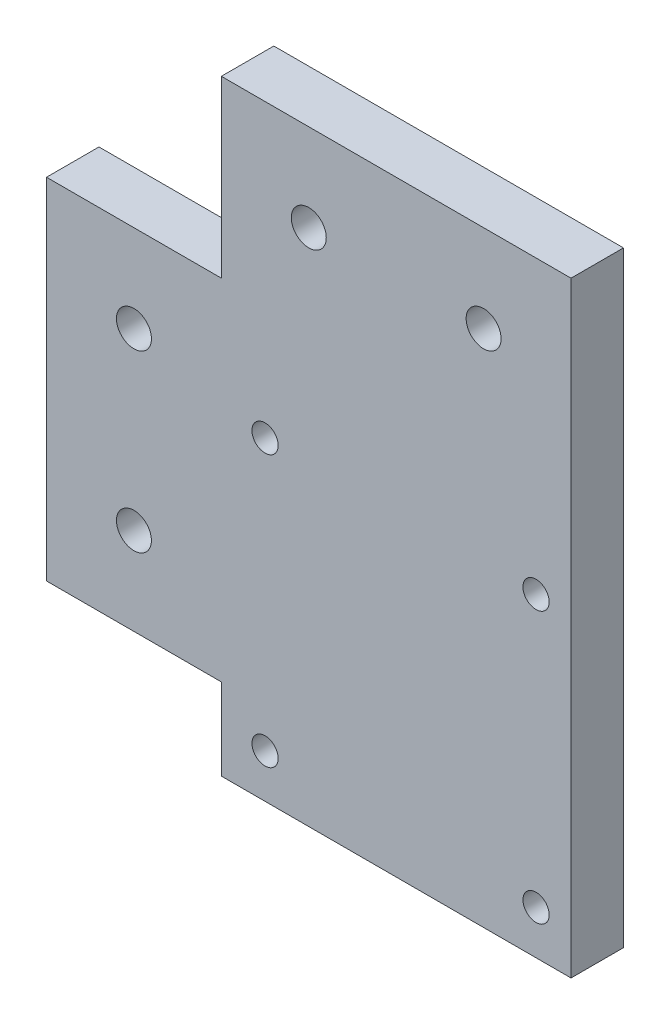
ISO-10303-21;
HEADER;
FILE_DESCRIPTION(('STEP AP214'),'2;1');
FILE_NAME('part.step','',(''),(''),'','','');
FILE_SCHEMA(('AUTOMOTIVE_DESIGN { 1 0 10303 214 1 1 1 1 }'));
ENDSEC;
DATA;
#1=APPLICATION_CONTEXT('core data for automotive mechanical design processes');
#2=APPLICATION_PROTOCOL_DEFINITION('international standard','automotive_design',2000,#1);
#3=PRODUCT_CONTEXT('',#1,'mechanical');
#4=PRODUCT('Part','Part','',(#3));
#5=PRODUCT_RELATED_PRODUCT_CATEGORY('part','',(#4));
#6=PRODUCT_DEFINITION_FORMATION('','',#4);
#7=PRODUCT_DEFINITION_CONTEXT('part definition',#1,'design');
#8=PRODUCT_DEFINITION('design','',#6,#7);
#9=PRODUCT_DEFINITION_SHAPE('','',#8);
#10=(LENGTH_UNIT() NAMED_UNIT(*) SI_UNIT(.MILLI.,.METRE.));
#11=(NAMED_UNIT(*) PLANE_ANGLE_UNIT() SI_UNIT($,.RADIAN.));
#12=(NAMED_UNIT(*) SI_UNIT($,.STERADIAN.) SOLID_ANGLE_UNIT());
#13=UNCERTAINTY_MEASURE_WITH_UNIT(LENGTH_MEASURE(1.E-05),#10,'distance_accuracy_value','');
#14=(GEOMETRIC_REPRESENTATION_CONTEXT(3) GLOBAL_UNCERTAINTY_ASSIGNED_CONTEXT((#13)) GLOBAL_UNIT_ASSIGNED_CONTEXT((#10,
#11,#12)) REPRESENTATION_CONTEXT('',''));
#15=CARTESIAN_POINT('',(0.,0.,0.));
#16=DIRECTION('',(0.,0.,1.));
#17=DIRECTION('',(1.,0.,0.));
#18=AXIS2_PLACEMENT_3D('',#15,#16,#17);
#19=CARTESIAN_POINT('',(0.,0.,6.));
#20=DIRECTION('',(0.,0.,1.));
#21=DIRECTION('',(1.,0.,0.));
#22=AXIS2_PLACEMENT_3D('',#19,#20,#21);
#23=PLANE('',#22);
#24=CARTESIAN_POINT('',(56.,-64.3319231231537,6.));
#25=DIRECTION('',(0.,0.,1.));
#26=DIRECTION('',(1.,0.,0.));
#27=AXIS2_PLACEMENT_3D('',#24,#25,#26);
#28=CIRCLE('',#27,1.5);
#29=CARTESIAN_POINT('',(57.5,-64.3319231231537,6.));
#30=VERTEX_POINT('',#29);
#31=EDGE_CURVE('E216',#30,#30,#28,.T.);
#32=ORIENTED_EDGE('',*,*,#31,.F.);
#33=EDGE_LOOP('',(#32));
#34=FACE_BOUND('',#33,.T.);
#35=CARTESIAN_POINT('',(25.,-64.3319231231537,6.));
#36=DIRECTION('',(0.,0.,1.));
#37=DIRECTION('',(1.,0.,0.));
#38=AXIS2_PLACEMENT_3D('',#35,#36,#37);
#39=CIRCLE('',#38,1.5);
#40=CARTESIAN_POINT('',(26.5,-64.3319231231537,6.));
#41=VERTEX_POINT('',#40);
#42=EDGE_CURVE('E204',#41,#41,#39,.T.);
#43=ORIENTED_EDGE('',*,*,#42,.F.);
#44=EDGE_LOOP('',(#43));
#45=FACE_BOUND('',#44,.T.);
#46=CARTESIAN_POINT('',(10.,-50.,6.));
#47=DIRECTION('',(0.,0.,1.));
#48=DIRECTION('',(1.,0.,0.));
#49=AXIS2_PLACEMENT_3D('',#46,#47,#48);
#50=CIRCLE('',#49,2.);
#51=CARTESIAN_POINT('',(12.,-50.,6.));
#52=VERTEX_POINT('',#51);
#53=EDGE_CURVE('E192',#52,#52,#50,.T.);
#54=ORIENTED_EDGE('',*,*,#53,.F.);
#55=EDGE_LOOP('',(#54));
#56=FACE_BOUND('',#55,.T.);
#57=CARTESIAN_POINT('',(50.,-10.,6.));
#58=DIRECTION('',(0.,0.,1.));
#59=DIRECTION('',(1.,0.,0.));
#60=AXIS2_PLACEMENT_3D('',#57,#58,#59);
#61=CIRCLE('',#60,2.);
#62=CARTESIAN_POINT('',(52.,-10.,6.));
#63=VERTEX_POINT('',#62);
#64=EDGE_CURVE('E138',#63,#63,#61,.T.);
#65=ORIENTED_EDGE('',*,*,#64,.F.);
#66=EDGE_LOOP('',(#65));
#67=FACE_BOUND('',#66,.T.);
#68=DIRECTION('',(1.,0.,0.));
#69=VECTOR('',#68,1.);
#70=CARTESIAN_POINT('',(0.,-60.,6.));
#71=LINE('',#70,#69);
#72=CARTESIAN_POINT('',(0.,-60.,6.));
#73=VERTEX_POINT('',#72);
#74=CARTESIAN_POINT('',(20.,-60.,6.));
#75=VERTEX_POINT('',#74);
#76=EDGE_CURVE('E150',#73,#75,#71,.T.);
#77=ORIENTED_EDGE('',*,*,#76,.T.);
#78=DIRECTION('',(0.,-1.,0.));
#79=VECTOR('',#78,1.);
#80=CARTESIAN_POINT('',(20.,-69.3319231231537,6.));
#81=LINE('',#80,#79);
#82=CARTESIAN_POINT('',(20.,-69.3319231231537,6.));
#83=VERTEX_POINT('',#82);
#84=EDGE_CURVE('E97',#75,#83,#81,.T.);
#85=ORIENTED_EDGE('',*,*,#84,.T.);
#86=DIRECTION('',(1.,0.,0.));
#87=VECTOR('',#86,1.);
#88=CARTESIAN_POINT('',(20.,-69.3319231231537,6.));
#89=LINE('',#88,#87);
#90=CARTESIAN_POINT('',(60.,-69.3319231231537,6.));
#91=VERTEX_POINT('',#90);
#92=EDGE_CURVE('E165',#83,#91,#89,.T.);
#93=ORIENTED_EDGE('',*,*,#92,.T.);
#94=DIRECTION('',(0.,1.,0.));
#95=VECTOR('',#94,1.);
#96=CARTESIAN_POINT('',(60.,-20.,6.));
#97=LINE('',#96,#95);
#98=CARTESIAN_POINT('',(60.,0.,6.));
#99=VERTEX_POINT('',#98);
#100=EDGE_CURVE('E177',#91,#99,#97,.T.);
#101=ORIENTED_EDGE('',*,*,#100,.T.);
#102=DIRECTION('',(-1.,0.,0.));
#103=VECTOR('',#102,1.);
#104=CARTESIAN_POINT('',(20.0000000001893,0.,6.));
#105=LINE('',#104,#103);
#106=CARTESIAN_POINT('',(20.0000000001893,0.,6.));
#107=VERTEX_POINT('',#106);
#108=EDGE_CURVE('E116',#99,#107,#105,.T.);
#109=ORIENTED_EDGE('',*,*,#108,.T.);
#110=DIRECTION('',(0.,-1.,0.));
#111=VECTOR('',#110,1.);
#112=CARTESIAN_POINT('',(20.0000000001893,0.,6.));
#113=LINE('',#112,#111);
#114=CARTESIAN_POINT('',(20.0000000001893,-20.0000000001893,6.));
#115=VERTEX_POINT('',#114);
#116=EDGE_CURVE('E110',#107,#115,#113,.T.);
#117=ORIENTED_EDGE('',*,*,#116,.T.);
#118=DIRECTION('',(-1.,0.,0.));
#119=VECTOR('',#118,1.);
#120=CARTESIAN_POINT('',(0.,-20.0000000001893,6.));
#121=LINE('',#120,#119);
#122=CARTESIAN_POINT('',(0.,-20.0000000001893,6.));
#123=VERTEX_POINT('',#122);
#124=EDGE_CURVE('E114',#115,#123,#121,.T.);
#125=ORIENTED_EDGE('',*,*,#124,.T.);
#126=DIRECTION('',(0.,-1.,0.));
#127=VECTOR('',#126,1.);
#128=CARTESIAN_POINT('',(0.,-20.0000000001893,6.));
#129=LINE('',#128,#127);
#130=EDGE_CURVE('E54',#123,#73,#129,.T.);
#131=ORIENTED_EDGE('',*,*,#130,.T.);
#132=EDGE_LOOP('',(#77,#85,#93,#101,#109,#117,#125,#131));
#133=FACE_BOUND('',#132,.T.);
#134=CARTESIAN_POINT('',(30.,-10.,6.));
#135=DIRECTION('',(0.,0.,1.));
#136=DIRECTION('',(1.,0.,0.));
#137=AXIS2_PLACEMENT_3D('',#134,#135,#136);
#138=CIRCLE('',#137,2.);
#139=CARTESIAN_POINT('',(32.,-10.,6.));
#140=VERTEX_POINT('',#139);
#141=EDGE_CURVE('E186',#140,#140,#138,.T.);
#142=ORIENTED_EDGE('',*,*,#141,.F.);
#143=EDGE_LOOP('',(#142));
#144=FACE_BOUND('',#143,.T.);
#145=CARTESIAN_POINT('',(10.,-30.,6.));
#146=DIRECTION('',(0.,0.,1.));
#147=DIRECTION('',(1.,0.,0.));
#148=AXIS2_PLACEMENT_3D('',#145,#146,#147);
#149=CIRCLE('',#148,2.);
#150=CARTESIAN_POINT('',(12.,-30.,6.));
#151=VERTEX_POINT('',#150);
#152=EDGE_CURVE('E198',#151,#151,#149,.T.);
#153=ORIENTED_EDGE('',*,*,#152,.F.);
#154=EDGE_LOOP('',(#153));
#155=FACE_BOUND('',#154,.T.);
#156=CARTESIAN_POINT('',(24.9973486711841,-33.3319232365334,6.));
#157=DIRECTION('',(0.,0.,1.));
#158=DIRECTION('',(1.,0.,0.));
#159=AXIS2_PLACEMENT_3D('',#156,#157,#158);
#160=CIRCLE('',#159,1.5);
#161=CARTESIAN_POINT('',(26.4973486711841,-33.3319232365334,6.));
#162=VERTEX_POINT('',#161);
#163=EDGE_CURVE('E210',#162,#162,#160,.T.);
#164=ORIENTED_EDGE('',*,*,#163,.F.);
#165=EDGE_LOOP('',(#164));
#166=FACE_BOUND('',#165,.T.);
#167=CARTESIAN_POINT('',(55.9973486711841,-33.3319231231537,6.));
#168=DIRECTION('',(0.,0.,1.));
#169=DIRECTION('',(1.,0.,0.));
#170=AXIS2_PLACEMENT_3D('',#167,#168,#169);
#171=CIRCLE('',#170,1.5);
#172=CARTESIAN_POINT('',(57.4973486711841,-33.3319231231537,6.));
#173=VERTEX_POINT('',#172);
#174=EDGE_CURVE('E222',#173,#173,#171,.T.);
#175=ORIENTED_EDGE('',*,*,#174,.F.);
#176=EDGE_LOOP('',(#175));
#177=FACE_BOUND('',#176,.T.);
#178=ADVANCED_FACE('F37',(#34,#45,#56,#67,#133,#144,#155,#166,#177),#23,.T.);
#179=CARTESIAN_POINT('',(0.,0.,0.));
#180=DIRECTION('',(0.,0.,1.));
#181=DIRECTION('',(1.,0.,0.));
#182=AXIS2_PLACEMENT_3D('',#179,#180,#181);
#183=PLANE('',#182);
#184=DIRECTION('',(1.,0.,0.));
#185=VECTOR('',#184,1.);
#186=CARTESIAN_POINT('',(0.,-60.,0.));
#187=LINE('',#186,#185);
#188=CARTESIAN_POINT('',(0.,-60.,0.));
#189=VERTEX_POINT('',#188);
#190=CARTESIAN_POINT('',(20.,-60.,0.));
#191=VERTEX_POINT('',#190);
#192=EDGE_CURVE('E134',#189,#191,#187,.T.);
#193=ORIENTED_EDGE('',*,*,#192,.F.);
#194=DIRECTION('',(0.,-1.,0.));
#195=VECTOR('',#194,1.);
#196=CARTESIAN_POINT('',(0.,-20.0000000001893,0.));
#197=LINE('',#196,#195);
#198=CARTESIAN_POINT('',(0.,-20.0000000001893,0.));
#199=VERTEX_POINT('',#198);
#200=EDGE_CURVE('E89',#199,#189,#197,.T.);
#201=ORIENTED_EDGE('',*,*,#200,.F.);
#202=DIRECTION('',(-1.,0.,0.));
#203=VECTOR('',#202,1.);
#204=CARTESIAN_POINT('',(0.,-20.0000000001893,0.));
#205=LINE('',#204,#203);
#206=CARTESIAN_POINT('',(20.0000000001893,-20.0000000001893,0.));
#207=VERTEX_POINT('',#206);
#208=EDGE_CURVE('E83',#207,#199,#205,.T.);
#209=ORIENTED_EDGE('',*,*,#208,.F.);
#210=DIRECTION('',(0.,-1.,0.));
#211=VECTOR('',#210,1.);
#212=CARTESIAN_POINT('',(20.0000000001893,0.,0.));
#213=LINE('',#212,#211);
#214=CARTESIAN_POINT('',(20.0000000001893,0.,0.));
#215=VERTEX_POINT('',#214);
#216=EDGE_CURVE('E124',#215,#207,#213,.T.);
#217=ORIENTED_EDGE('',*,*,#216,.F.);
#218=DIRECTION('',(-1.,0.,0.));
#219=VECTOR('',#218,1.);
#220=CARTESIAN_POINT('',(20.0000000001893,0.,0.));
#221=LINE('',#220,#219);
#222=CARTESIAN_POINT('',(60.,0.,0.));
#223=VERTEX_POINT('',#222);
#224=EDGE_CURVE('E145',#223,#215,#221,.T.);
#225=ORIENTED_EDGE('',*,*,#224,.F.);
#226=DIRECTION('',(0.,1.,0.));
#227=VECTOR('',#226,1.);
#228=CARTESIAN_POINT('',(60.,0.,0.));
#229=LINE('',#228,#227);
#230=CARTESIAN_POINT('',(60.,-69.3319231231537,0.));
#231=VERTEX_POINT('',#230);
#232=EDGE_CURVE('E143',#231,#223,#229,.T.);
#233=ORIENTED_EDGE('',*,*,#232,.F.);
#234=DIRECTION('',(1.,0.,0.));
#235=VECTOR('',#234,1.);
#236=CARTESIAN_POINT('',(20.,-69.3319231231537,0.));
#237=LINE('',#236,#235);
#238=CARTESIAN_POINT('',(20.,-69.3319231231537,0.));
#239=VERTEX_POINT('',#238);
#240=EDGE_CURVE('E140',#239,#231,#237,.T.);
#241=ORIENTED_EDGE('',*,*,#240,.F.);
#242=DIRECTION('',(0.,-1.,0.));
#243=VECTOR('',#242,1.);
#244=CARTESIAN_POINT('',(20.,-69.3319231231537,0.));
#245=LINE('',#244,#243);
#246=EDGE_CURVE('E137',#191,#239,#245,.T.);
#247=ORIENTED_EDGE('',*,*,#246,.F.);
#248=EDGE_LOOP('',(#193,#201,#209,#217,#225,#233,#241,#247));
#249=FACE_BOUND('',#248,.T.);
#250=CARTESIAN_POINT('',(50.,-10.,0.));
#251=DIRECTION('',(0.,0.,1.));
#252=DIRECTION('',(1.,0.,0.));
#253=AXIS2_PLACEMENT_3D('',#250,#251,#252);
#254=CIRCLE('',#253,2.);
#255=CARTESIAN_POINT('',(52.,-10.,0.));
#256=VERTEX_POINT('',#255);
#257=EDGE_CURVE('E183',#256,#256,#254,.T.);
#258=ORIENTED_EDGE('',*,*,#257,.T.);
#259=EDGE_LOOP('',(#258));
#260=FACE_BOUND('',#259,.T.);
#261=CARTESIAN_POINT('',(30.,-10.,0.));
#262=DIRECTION('',(0.,0.,1.));
#263=DIRECTION('',(1.,0.,0.));
#264=AXIS2_PLACEMENT_3D('',#261,#262,#263);
#265=CIRCLE('',#264,2.);
#266=CARTESIAN_POINT('',(32.,-10.,0.));
#267=VERTEX_POINT('',#266);
#268=EDGE_CURVE('E189',#267,#267,#265,.T.);
#269=ORIENTED_EDGE('',*,*,#268,.T.);
#270=EDGE_LOOP('',(#269));
#271=FACE_BOUND('',#270,.T.);
#272=CARTESIAN_POINT('',(10.,-50.,0.));
#273=DIRECTION('',(0.,0.,1.));
#274=DIRECTION('',(1.,0.,0.));
#275=AXIS2_PLACEMENT_3D('',#272,#273,#274);
#276=CIRCLE('',#275,2.);
#277=CARTESIAN_POINT('',(12.,-50.,0.));
#278=VERTEX_POINT('',#277);
#279=EDGE_CURVE('E195',#278,#278,#276,.T.);
#280=ORIENTED_EDGE('',*,*,#279,.T.);
#281=EDGE_LOOP('',(#280));
#282=FACE_BOUND('',#281,.T.);
#283=CARTESIAN_POINT('',(10.,-30.,0.));
#284=DIRECTION('',(0.,0.,1.));
#285=DIRECTION('',(1.,0.,0.));
#286=AXIS2_PLACEMENT_3D('',#283,#284,#285);
#287=CIRCLE('',#286,2.);
#288=CARTESIAN_POINT('',(12.,-30.,0.));
#289=VERTEX_POINT('',#288);
#290=EDGE_CURVE('E201',#289,#289,#287,.T.);
#291=ORIENTED_EDGE('',*,*,#290,.T.);
#292=EDGE_LOOP('',(#291));
#293=FACE_BOUND('',#292,.T.);
#294=CARTESIAN_POINT('',(25.,-64.3319231231537,0.));
#295=DIRECTION('',(0.,0.,1.));
#296=DIRECTION('',(1.,0.,0.));
#297=AXIS2_PLACEMENT_3D('',#294,#295,#296);
#298=CIRCLE('',#297,1.5);
#299=CARTESIAN_POINT('',(26.5,-64.3319231231537,0.));
#300=VERTEX_POINT('',#299);
#301=EDGE_CURVE('E207',#300,#300,#298,.T.);
#302=ORIENTED_EDGE('',*,*,#301,.T.);
#303=EDGE_LOOP('',(#302));
#304=FACE_BOUND('',#303,.T.);
#305=CARTESIAN_POINT('',(24.9973486711841,-33.3319232365334,0.));
#306=DIRECTION('',(0.,0.,1.));
#307=DIRECTION('',(1.,0.,0.));
#308=AXIS2_PLACEMENT_3D('',#305,#306,#307);
#309=CIRCLE('',#308,1.5);
#310=CARTESIAN_POINT('',(26.4973486711841,-33.3319232365334,0.));
#311=VERTEX_POINT('',#310);
#312=EDGE_CURVE('E213',#311,#311,#309,.T.);
#313=ORIENTED_EDGE('',*,*,#312,.T.);
#314=EDGE_LOOP('',(#313));
#315=FACE_BOUND('',#314,.T.);
#316=CARTESIAN_POINT('',(56.,-64.3319231231537,0.));
#317=DIRECTION('',(0.,0.,1.));
#318=DIRECTION('',(1.,0.,0.));
#319=AXIS2_PLACEMENT_3D('',#316,#317,#318);
#320=CIRCLE('',#319,1.5);
#321=CARTESIAN_POINT('',(57.5,-64.3319231231537,0.));
#322=VERTEX_POINT('',#321);
#323=EDGE_CURVE('E219',#322,#322,#320,.T.);
#324=ORIENTED_EDGE('',*,*,#323,.T.);
#325=EDGE_LOOP('',(#324));
#326=FACE_BOUND('',#325,.T.);
#327=CARTESIAN_POINT('',(55.9973486711841,-33.3319231231537,0.));
#328=DIRECTION('',(0.,0.,1.));
#329=DIRECTION('',(1.,0.,0.));
#330=AXIS2_PLACEMENT_3D('',#327,#328,#329);
#331=CIRCLE('',#330,1.5);
#332=CARTESIAN_POINT('',(57.4973486711841,-33.3319231231537,0.));
#333=VERTEX_POINT('',#332);
#334=EDGE_CURVE('E225',#333,#333,#331,.T.);
#335=ORIENTED_EDGE('',*,*,#334,.T.);
#336=EDGE_LOOP('',(#335));
#337=FACE_BOUND('',#336,.T.);
#338=ADVANCED_FACE('F168',(#249,#260,#271,#282,#293,#304,#315,#326,#337),#183,.F.);
#339=CARTESIAN_POINT('',(0.,-60.,6.));
#340=DIRECTION('',(0.,1.,0.));
#341=DIRECTION('',(0.,0.,1.));
#342=AXIS2_PLACEMENT_3D('',#339,#340,#341);
#343=PLANE('',#342);
#344=ORIENTED_EDGE('',*,*,#192,.T.);
#345=DIRECTION('',(0.,0.,-1.));
#346=VECTOR('',#345,1.);
#347=CARTESIAN_POINT('',(20.,-60.,6.));
#348=LINE('',#347,#346);
#349=EDGE_CURVE('E11',#75,#191,#348,.T.);
#350=ORIENTED_EDGE('',*,*,#349,.F.);
#351=ORIENTED_EDGE('',*,*,#76,.F.);
#352=DIRECTION('',(0.,0.,-1.));
#353=VECTOR('',#352,1.);
#354=CARTESIAN_POINT('',(0.,-60.,6.));
#355=LINE('',#354,#353);
#356=EDGE_CURVE('E130',#73,#189,#355,.T.);
#357=ORIENTED_EDGE('',*,*,#356,.T.);
#358=EDGE_LOOP('',(#344,#350,#351,#357));
#359=FACE_BOUND('',#358,.T.);
#360=ADVANCED_FACE('F39',(#359),#343,.F.);
#361=CARTESIAN_POINT('',(20.,-69.3319231231537,6.));
#362=DIRECTION('',(1.,0.,0.));
#363=DIRECTION('',(0.,1.,0.));
#364=AXIS2_PLACEMENT_3D('',#361,#362,#363);
#365=PLANE('',#364);
#366=ORIENTED_EDGE('',*,*,#246,.T.);
#367=DIRECTION('',(0.,0.,-1.));
#368=VECTOR('',#367,1.);
#369=CARTESIAN_POINT('',(20.,-69.3319231231537,6.));
#370=LINE('',#369,#368);
#371=EDGE_CURVE('E46',#83,#239,#370,.T.);
#372=ORIENTED_EDGE('',*,*,#371,.F.);
#373=ORIENTED_EDGE('',*,*,#84,.F.);
#374=ORIENTED_EDGE('',*,*,#349,.T.);
#375=EDGE_LOOP('',(#366,#372,#373,#374));
#376=FACE_BOUND('',#375,.T.);
#377=ADVANCED_FACE('F259',(#376),#365,.F.);
#378=CARTESIAN_POINT('',(20.,-69.3319231231537,6.));
#379=DIRECTION('',(0.,1.,0.));
#380=DIRECTION('',(0.,0.,1.));
#381=AXIS2_PLACEMENT_3D('',#378,#379,#380);
#382=PLANE('',#381);
#383=ORIENTED_EDGE('',*,*,#240,.T.);
#384=DIRECTION('',(0.,0.,-1.));
#385=VECTOR('',#384,1.);
#386=CARTESIAN_POINT('',(60.,-69.3319231231537,6.));
#387=LINE('',#386,#385);
#388=EDGE_CURVE('E157',#91,#231,#387,.T.);
#389=ORIENTED_EDGE('',*,*,#388,.F.);
#390=ORIENTED_EDGE('',*,*,#92,.F.);
#391=ORIENTED_EDGE('',*,*,#371,.T.);
#392=EDGE_LOOP('',(#383,#389,#390,#391));
#393=FACE_BOUND('',#392,.T.);
#394=ADVANCED_FACE('F163',(#393),#382,.F.);
#395=CARTESIAN_POINT('',(60.,0.,6.));
#396=DIRECTION('',(-1.,0.,0.));
#397=DIRECTION('',(0.,0.,1.));
#398=AXIS2_PLACEMENT_3D('',#395,#396,#397);
#399=PLANE('',#398);
#400=ORIENTED_EDGE('',*,*,#232,.T.);
#401=DIRECTION('',(0.,0.,-1.));
#402=VECTOR('',#401,1.);
#403=CARTESIAN_POINT('',(60.,0.,6.));
#404=LINE('',#403,#402);
#405=EDGE_CURVE('E154',#99,#223,#404,.T.);
#406=ORIENTED_EDGE('',*,*,#405,.F.);
#407=ORIENTED_EDGE('',*,*,#100,.F.);
#408=ORIENTED_EDGE('',*,*,#388,.T.);
#409=EDGE_LOOP('',(#400,#406,#407,#408));
#410=FACE_BOUND('',#409,.T.);
#411=ADVANCED_FACE('F173',(#410),#399,.F.);
#412=CARTESIAN_POINT('',(20.0000000001893,0.,6.));
#413=DIRECTION('',(0.,-1.,0.));
#414=DIRECTION('',(0.,0.,-1.));
#415=AXIS2_PLACEMENT_3D('',#412,#413,#414);
#416=PLANE('',#415);
#417=ORIENTED_EDGE('',*,*,#224,.T.);
#418=DIRECTION('',(0.,0.,-1.));
#419=VECTOR('',#418,1.);
#420=CARTESIAN_POINT('',(20.0000000001893,0.,6.));
#421=LINE('',#420,#419);
#422=EDGE_CURVE('E125',#107,#215,#421,.T.);
#423=ORIENTED_EDGE('',*,*,#422,.F.);
#424=ORIENTED_EDGE('',*,*,#108,.F.);
#425=ORIENTED_EDGE('',*,*,#405,.T.);
#426=EDGE_LOOP('',(#417,#423,#424,#425));
#427=FACE_BOUND('',#426,.T.);
#428=ADVANCED_FACE('F176',(#427),#416,.F.);
#429=CARTESIAN_POINT('',(20.0000000001893,0.,6.));
#430=DIRECTION('',(1.,0.,0.));
#431=DIRECTION('',(0.,1.,0.));
#432=AXIS2_PLACEMENT_3D('',#429,#430,#431);
#433=PLANE('',#432);
#434=ORIENTED_EDGE('',*,*,#216,.T.);
#435=DIRECTION('',(0.,0.,-1.));
#436=VECTOR('',#435,1.);
#437=CARTESIAN_POINT('',(20.0000000001893,-20.0000000001893,6.));
#438=LINE('',#437,#436);
#439=EDGE_CURVE('E121',#115,#207,#438,.T.);
#440=ORIENTED_EDGE('',*,*,#439,.F.);
#441=ORIENTED_EDGE('',*,*,#116,.F.);
#442=ORIENTED_EDGE('',*,*,#422,.T.);
#443=EDGE_LOOP('',(#434,#440,#441,#442));
#444=FACE_BOUND('',#443,.T.);
#445=ADVANCED_FACE('F122',(#444),#433,.F.);
#446=CARTESIAN_POINT('',(0.,-20.0000000001893,6.));
#447=DIRECTION('',(0.,-1.,0.));
#448=DIRECTION('',(0.,0.,-1.));
#449=AXIS2_PLACEMENT_3D('',#446,#447,#448);
#450=PLANE('',#449);
#451=ORIENTED_EDGE('',*,*,#208,.T.);
#452=DIRECTION('',(0.,0.,-1.));
#453=VECTOR('',#452,1.);
#454=CARTESIAN_POINT('',(0.,-20.0000000001893,6.));
#455=LINE('',#454,#453);
#456=EDGE_CURVE('E126',#123,#199,#455,.T.);
#457=ORIENTED_EDGE('',*,*,#456,.F.);
#458=ORIENTED_EDGE('',*,*,#124,.F.);
#459=ORIENTED_EDGE('',*,*,#439,.T.);
#460=EDGE_LOOP('',(#451,#457,#458,#459));
#461=FACE_BOUND('',#460,.T.);
#462=ADVANCED_FACE('F128',(#461),#450,.F.);
#463=CARTESIAN_POINT('',(0.,-20.0000000001893,6.));
#464=DIRECTION('',(1.,0.,0.));
#465=DIRECTION('',(0.,1.,0.));
#466=AXIS2_PLACEMENT_3D('',#463,#464,#465);
#467=PLANE('',#466);
#468=ORIENTED_EDGE('',*,*,#200,.T.);
#469=ORIENTED_EDGE('',*,*,#356,.F.);
#470=ORIENTED_EDGE('',*,*,#130,.F.);
#471=ORIENTED_EDGE('',*,*,#456,.T.);
#472=EDGE_LOOP('',(#468,#469,#470,#471));
#473=FACE_BOUND('',#472,.T.);
#474=ADVANCED_FACE('F247',(#473),#467,.F.);
#475=CARTESIAN_POINT('',(50.,-10.,6.));
#476=DIRECTION('',(0.,0.,-1.));
#477=DIRECTION('',(-1.,0.,0.));
#478=AXIS2_PLACEMENT_3D('',#475,#476,#477);
#479=CYLINDRICAL_SURFACE('',#478,2.);
#480=ORIENTED_EDGE('',*,*,#64,.T.);
#481=EDGE_LOOP('',(#480));
#482=FACE_BOUND('',#481,.T.);
#483=ORIENTED_EDGE('',*,*,#257,.F.);
#484=EDGE_LOOP('',(#483));
#485=FACE_BOUND('',#484,.T.);
#486=ADVANCED_FACE('F244',(#482,#485),#479,.F.);
#487=CARTESIAN_POINT('',(30.,-10.,6.));
#488=DIRECTION('',(0.,0.,-1.));
#489=DIRECTION('',(-1.,0.,0.));
#490=AXIS2_PLACEMENT_3D('',#487,#488,#489);
#491=CYLINDRICAL_SURFACE('',#490,2.);
#492=ORIENTED_EDGE('',*,*,#141,.T.);
#493=EDGE_LOOP('',(#492));
#494=FACE_BOUND('',#493,.T.);
#495=ORIENTED_EDGE('',*,*,#268,.F.);
#496=EDGE_LOOP('',(#495));
#497=FACE_BOUND('',#496,.T.);
#498=ADVANCED_FACE('F311',(#494,#497),#491,.F.);
#499=CARTESIAN_POINT('',(10.,-50.,6.));
#500=DIRECTION('',(0.,0.,-1.));
#501=DIRECTION('',(-1.,0.,0.));
#502=AXIS2_PLACEMENT_3D('',#499,#500,#501);
#503=CYLINDRICAL_SURFACE('',#502,2.);
#504=ORIENTED_EDGE('',*,*,#53,.T.);
#505=EDGE_LOOP('',(#504));
#506=FACE_BOUND('',#505,.T.);
#507=ORIENTED_EDGE('',*,*,#279,.F.);
#508=EDGE_LOOP('',(#507));
#509=FACE_BOUND('',#508,.T.);
#510=ADVANCED_FACE('F318',(#506,#509),#503,.F.);
#511=CARTESIAN_POINT('',(10.,-30.,6.));
#512=DIRECTION('',(0.,0.,-1.));
#513=DIRECTION('',(-1.,0.,0.));
#514=AXIS2_PLACEMENT_3D('',#511,#512,#513);
#515=CYLINDRICAL_SURFACE('',#514,2.);
#516=ORIENTED_EDGE('',*,*,#152,.T.);
#517=EDGE_LOOP('',(#516));
#518=FACE_BOUND('',#517,.T.);
#519=ORIENTED_EDGE('',*,*,#290,.F.);
#520=EDGE_LOOP('',(#519));
#521=FACE_BOUND('',#520,.T.);
#522=ADVANCED_FACE('F325',(#518,#521),#515,.F.);
#523=CARTESIAN_POINT('',(25.,-64.3319231231537,6.));
#524=DIRECTION('',(0.,0.,-1.));
#525=DIRECTION('',(-1.,0.,0.));
#526=AXIS2_PLACEMENT_3D('',#523,#524,#525);
#527=CYLINDRICAL_SURFACE('',#526,1.5);
#528=ORIENTED_EDGE('',*,*,#42,.T.);
#529=EDGE_LOOP('',(#528));
#530=FACE_BOUND('',#529,.T.);
#531=ORIENTED_EDGE('',*,*,#301,.F.);
#532=EDGE_LOOP('',(#531));
#533=FACE_BOUND('',#532,.T.);
#534=ADVANCED_FACE('F333',(#530,#533),#527,.F.);
#535=CARTESIAN_POINT('',(24.9973486711841,-33.3319232365334,6.));
#536=DIRECTION('',(0.,0.,-1.));
#537=DIRECTION('',(-1.,0.,0.));
#538=AXIS2_PLACEMENT_3D('',#535,#536,#537);
#539=CYLINDRICAL_SURFACE('',#538,1.5);
#540=ORIENTED_EDGE('',*,*,#163,.T.);
#541=EDGE_LOOP('',(#540));
#542=FACE_BOUND('',#541,.T.);
#543=ORIENTED_EDGE('',*,*,#312,.F.);
#544=EDGE_LOOP('',(#543));
#545=FACE_BOUND('',#544,.T.);
#546=ADVANCED_FACE('F341',(#542,#545),#539,.F.);
#547=CARTESIAN_POINT('',(56.,-64.3319231231537,6.));
#548=DIRECTION('',(0.,0.,-1.));
#549=DIRECTION('',(-1.,0.,0.));
#550=AXIS2_PLACEMENT_3D('',#547,#548,#549);
#551=CYLINDRICAL_SURFACE('',#550,1.5);
#552=ORIENTED_EDGE('',*,*,#31,.T.);
#553=EDGE_LOOP('',(#552));
#554=FACE_BOUND('',#553,.T.);
#555=ORIENTED_EDGE('',*,*,#323,.F.);
#556=EDGE_LOOP('',(#555));
#557=FACE_BOUND('',#556,.T.);
#558=ADVANCED_FACE('F349',(#554,#557),#551,.F.);
#559=CARTESIAN_POINT('',(55.9973486711841,-33.3319231231537,6.));
#560=DIRECTION('',(0.,0.,-1.));
#561=DIRECTION('',(-1.,0.,0.));
#562=AXIS2_PLACEMENT_3D('',#559,#560,#561);
#563=CYLINDRICAL_SURFACE('',#562,1.5);
#564=ORIENTED_EDGE('',*,*,#174,.T.);
#565=EDGE_LOOP('',(#564));
#566=FACE_BOUND('',#565,.T.);
#567=ORIENTED_EDGE('',*,*,#334,.F.);
#568=EDGE_LOOP('',(#567));
#569=FACE_BOUND('',#568,.T.);
#570=ADVANCED_FACE('F231',(#566,#569),#563,.F.);
#571=CLOSED_SHELL('',(#178,#338,#360,#377,#394,#411,#428,#445,#462,#474,#486,#498,#510,#522,
#534,#546,#558,#570));
#572=MANIFOLD_SOLID_BREP('B2',#571);
#573=ADVANCED_BREP_SHAPE_REPRESENTATION('',(#18,#572),#14);
#574=SHAPE_DEFINITION_REPRESENTATION(#9,#573);
ENDSEC;
END-ISO-10303-21;
